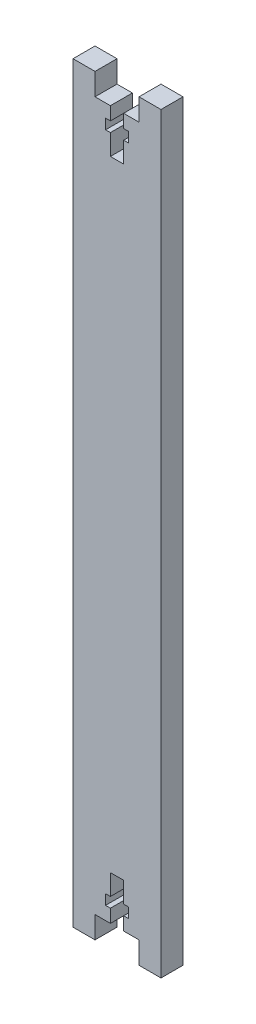
ISO-10303-21;
HEADER;
FILE_DESCRIPTION(('STEP AP214'),'2;1');
FILE_NAME('part.step','',(''),(''),'','','');
FILE_SCHEMA(('AUTOMOTIVE_DESIGN { 1 0 10303 214 1 1 1 1 }'));
ENDSEC;
DATA;
#1=APPLICATION_CONTEXT('core data for automotive mechanical design processes');
#2=APPLICATION_PROTOCOL_DEFINITION('international standard','automotive_design',2000,#1);
#3=PRODUCT_CONTEXT('',#1,'mechanical');
#4=PRODUCT('Part','Part','',(#3));
#5=PRODUCT_RELATED_PRODUCT_CATEGORY('part','',(#4));
#6=PRODUCT_DEFINITION_FORMATION('','',#4);
#7=PRODUCT_DEFINITION_CONTEXT('part definition',#1,'design');
#8=PRODUCT_DEFINITION('design','',#6,#7);
#9=PRODUCT_DEFINITION_SHAPE('','',#8);
#10=(LENGTH_UNIT() NAMED_UNIT(*) SI_UNIT(.MILLI.,.METRE.));
#11=(NAMED_UNIT(*) PLANE_ANGLE_UNIT() SI_UNIT($,.RADIAN.));
#12=(NAMED_UNIT(*) SI_UNIT($,.STERADIAN.) SOLID_ANGLE_UNIT());
#13=UNCERTAINTY_MEASURE_WITH_UNIT(LENGTH_MEASURE(1.E-05),#10,'distance_accuracy_value','');
#14=(GEOMETRIC_REPRESENTATION_CONTEXT(3) GLOBAL_UNCERTAINTY_ASSIGNED_CONTEXT((#13)) GLOBAL_UNIT_ASSIGNED_CONTEXT((#10,
#11,#12)) REPRESENTATION_CONTEXT('',''));
#15=CARTESIAN_POINT('',(0.,0.,0.));
#16=DIRECTION('',(0.,0.,1.));
#17=DIRECTION('',(1.,0.,0.));
#18=AXIS2_PLACEMENT_3D('',#15,#16,#17);
#19=CARTESIAN_POINT('',(-20.,0.,5.));
#20=DIRECTION('',(1.,0.,0.));
#21=DIRECTION('',(0.,0.,-1.));
#22=AXIS2_PLACEMENT_3D('',#19,#20,#21);
#23=PLANE('',#22);
#24=DIRECTION('',(0.,-1.,0.));
#25=VECTOR('',#24,1.);
#26=CARTESIAN_POINT('',(-20.,0.,0.));
#27=LINE('',#26,#25);
#28=CARTESIAN_POINT('',(-20.,171.,0.));
#29=VERTEX_POINT('',#28);
#30=CARTESIAN_POINT('',(-20.,0.,0.));
#31=VERTEX_POINT('',#30);
#32=EDGE_CURVE('E169',#29,#31,#27,.T.);
#33=ORIENTED_EDGE('',*,*,#32,.T.);
#34=DIRECTION('',(0.,0.,-1.));
#35=VECTOR('',#34,1.);
#36=CARTESIAN_POINT('',(-20.,0.,5.));
#37=LINE('',#36,#35);
#38=CARTESIAN_POINT('',(-20.,0.,5.));
#39=VERTEX_POINT('',#38);
#40=EDGE_CURVE('E11',#39,#31,#37,.T.);
#41=ORIENTED_EDGE('',*,*,#40,.F.);
#42=DIRECTION('',(0.,-1.,0.));
#43=VECTOR('',#42,1.);
#44=CARTESIAN_POINT('',(-20.,171.,5.));
#45=LINE('',#44,#43);
#46=CARTESIAN_POINT('',(-20.,171.,5.));
#47=VERTEX_POINT('',#46);
#48=EDGE_CURVE('E175',#47,#39,#45,.T.);
#49=ORIENTED_EDGE('',*,*,#48,.F.);
#50=DIRECTION('',(0.,0.,-1.));
#51=VECTOR('',#50,1.);
#52=CARTESIAN_POINT('',(-20.,171.,5.));
#53=LINE('',#52,#51);
#54=EDGE_CURVE('E293',#47,#29,#53,.T.);
#55=ORIENTED_EDGE('',*,*,#54,.T.);
#56=EDGE_LOOP('',(#33,#41,#49,#55));
#57=FACE_BOUND('',#56,.T.);
#58=ADVANCED_FACE('F33',(#57),#23,.F.);
#59=CARTESIAN_POINT('',(-15.,0.,5.));
#60=DIRECTION('',(0.,1.,0.));
#61=DIRECTION('',(0.,0.,1.));
#62=AXIS2_PLACEMENT_3D('',#59,#60,#61);
#63=PLANE('',#62);
#64=DIRECTION('',(1.,0.,0.));
#65=VECTOR('',#64,1.);
#66=CARTESIAN_POINT('',(-15.,0.,0.));
#67=LINE('',#66,#65);
#68=CARTESIAN_POINT('',(-15.,0.,0.));
#69=VERTEX_POINT('',#68);
#70=EDGE_CURVE('E298',#31,#69,#67,.T.);
#71=ORIENTED_EDGE('',*,*,#70,.T.);
#72=DIRECTION('',(0.,0.,-1.));
#73=VECTOR('',#72,1.);
#74=CARTESIAN_POINT('',(-15.,0.,5.));
#75=LINE('',#74,#73);
#76=CARTESIAN_POINT('',(-15.,0.,5.));
#77=VERTEX_POINT('',#76);
#78=EDGE_CURVE('E41',#77,#69,#75,.T.);
#79=ORIENTED_EDGE('',*,*,#78,.F.);
#80=DIRECTION('',(1.,0.,0.));
#81=VECTOR('',#80,1.);
#82=CARTESIAN_POINT('',(-15.,0.,5.));
#83=LINE('',#82,#81);
#84=EDGE_CURVE('E555',#39,#77,#83,.T.);
#85=ORIENTED_EDGE('',*,*,#84,.F.);
#86=ORIENTED_EDGE('',*,*,#40,.T.);
#87=EDGE_LOOP('',(#71,#79,#85,#86));
#88=FACE_BOUND('',#87,.T.);
#89=ADVANCED_FACE('F558',(#88),#63,.F.);
#90=CARTESIAN_POINT('',(-15.,0.,5.));
#91=DIRECTION('',(-1.,0.,0.));
#92=DIRECTION('',(0.,0.,1.));
#93=AXIS2_PLACEMENT_3D('',#90,#91,#92);
#94=PLANE('',#93);
#95=DIRECTION('',(0.,1.,0.));
#96=VECTOR('',#95,1.);
#97=CARTESIAN_POINT('',(-15.,0.,0.));
#98=LINE('',#97,#96);
#99=CARTESIAN_POINT('',(-15.,5.,0.));
#100=VERTEX_POINT('',#99);
#101=EDGE_CURVE('E300',#69,#100,#98,.T.);
#102=ORIENTED_EDGE('',*,*,#101,.T.);
#103=DIRECTION('',(0.,0.,-1.));
#104=VECTOR('',#103,1.);
#105=CARTESIAN_POINT('',(-15.,5.,5.));
#106=LINE('',#105,#104);
#107=CARTESIAN_POINT('',(-15.,5.,5.));
#108=VERTEX_POINT('',#107);
#109=EDGE_CURVE('E458',#108,#100,#106,.T.);
#110=ORIENTED_EDGE('',*,*,#109,.F.);
#111=DIRECTION('',(0.,1.,0.));
#112=VECTOR('',#111,1.);
#113=CARTESIAN_POINT('',(-15.,0.,5.));
#114=LINE('',#113,#112);
#115=EDGE_CURVE('E467',#77,#108,#114,.T.);
#116=ORIENTED_EDGE('',*,*,#115,.F.);
#117=ORIENTED_EDGE('',*,*,#78,.T.);
#118=EDGE_LOOP('',(#102,#110,#116,#117));
#119=FACE_BOUND('',#118,.T.);
#120=ADVANCED_FACE('F465',(#119),#94,.F.);
#121=CARTESIAN_POINT('',(-11.5,5.,5.));
#122=DIRECTION('',(0.,1.,0.));
#123=DIRECTION('',(-1.,0.,0.));
#124=AXIS2_PLACEMENT_3D('',#121,#122,#123);
#125=PLANE('',#124);
#126=DIRECTION('',(1.,0.,0.));
#127=VECTOR('',#126,1.);
#128=CARTESIAN_POINT('',(-11.5,5.,0.));
#129=LINE('',#128,#127);
#130=CARTESIAN_POINT('',(-11.5,5.,0.));
#131=VERTEX_POINT('',#130);
#132=EDGE_CURVE('E302',#100,#131,#129,.T.);
#133=ORIENTED_EDGE('',*,*,#132,.T.);
#134=DIRECTION('',(0.,0.,-1.));
#135=VECTOR('',#134,1.);
#136=CARTESIAN_POINT('',(-11.5,5.,5.));
#137=LINE('',#136,#135);
#138=CARTESIAN_POINT('',(-11.5,5.,5.));
#139=VERTEX_POINT('',#138);
#140=EDGE_CURVE('E455',#139,#131,#137,.T.);
#141=ORIENTED_EDGE('',*,*,#140,.F.);
#142=DIRECTION('',(1.,0.,0.));
#143=VECTOR('',#142,1.);
#144=CARTESIAN_POINT('',(-11.5,5.,5.));
#145=LINE('',#144,#143);
#146=EDGE_CURVE('E485',#108,#139,#145,.T.);
#147=ORIENTED_EDGE('',*,*,#146,.F.);
#148=ORIENTED_EDGE('',*,*,#109,.T.);
#149=EDGE_LOOP('',(#133,#141,#147,#148));
#150=FACE_BOUND('',#149,.T.);
#151=ADVANCED_FACE('F476',(#150),#125,.F.);
#152=CARTESIAN_POINT('',(-11.5,8.,5.));
#153=DIRECTION('',(-1.,0.,0.));
#154=DIRECTION('',(0.,-1.,0.));
#155=AXIS2_PLACEMENT_3D('',#152,#153,#154);
#156=PLANE('',#155);
#157=DIRECTION('',(0.,1.,0.));
#158=VECTOR('',#157,1.);
#159=CARTESIAN_POINT('',(-11.5,8.,0.));
#160=LINE('',#159,#158);
#161=CARTESIAN_POINT('',(-11.5,8.,0.));
#162=VERTEX_POINT('',#161);
#163=EDGE_CURVE('E304',#131,#162,#160,.T.);
#164=ORIENTED_EDGE('',*,*,#163,.T.);
#165=DIRECTION('',(0.,0.,-1.));
#166=VECTOR('',#165,1.);
#167=CARTESIAN_POINT('',(-11.5,8.,5.));
#168=LINE('',#167,#166);
#169=CARTESIAN_POINT('',(-11.5,8.,5.));
#170=VERTEX_POINT('',#169);
#171=EDGE_CURVE('E452',#170,#162,#168,.T.);
#172=ORIENTED_EDGE('',*,*,#171,.F.);
#173=DIRECTION('',(0.,1.,0.));
#174=VECTOR('',#173,1.);
#175=CARTESIAN_POINT('',(-11.5,8.,5.));
#176=LINE('',#175,#174);
#177=EDGE_CURVE('E482',#139,#170,#176,.T.);
#178=ORIENTED_EDGE('',*,*,#177,.F.);
#179=ORIENTED_EDGE('',*,*,#140,.T.);
#180=EDGE_LOOP('',(#164,#172,#178,#179));
#181=FACE_BOUND('',#180,.T.);
#182=ADVANCED_FACE('F480',(#181),#156,.F.);
#183=CARTESIAN_POINT('',(-11.5,8.,5.));
#184=DIRECTION('',(0.,-1.,0.));
#185=DIRECTION('',(1.,0.,0.));
#186=AXIS2_PLACEMENT_3D('',#183,#184,#185);
#187=PLANE('',#186);
#188=DIRECTION('',(-1.,0.,0.));
#189=VECTOR('',#188,1.);
#190=CARTESIAN_POINT('',(-11.5,8.,0.));
#191=LINE('',#190,#189);
#192=CARTESIAN_POINT('',(-12.6,8.00000000000001,0.));
#193=VERTEX_POINT('',#192);
#194=EDGE_CURVE('E306',#162,#193,#191,.T.);
#195=ORIENTED_EDGE('',*,*,#194,.T.);
#196=DIRECTION('',(0.,0.,-1.));
#197=VECTOR('',#196,1.);
#198=CARTESIAN_POINT('',(-12.6,8.00000000000001,5.));
#199=LINE('',#198,#197);
#200=CARTESIAN_POINT('',(-12.6,8.00000000000001,5.));
#201=VERTEX_POINT('',#200);
#202=EDGE_CURVE('E449',#201,#193,#199,.T.);
#203=ORIENTED_EDGE('',*,*,#202,.F.);
#204=DIRECTION('',(-1.,0.,0.));
#205=VECTOR('',#204,1.);
#206=CARTESIAN_POINT('',(-11.5,8.,5.));
#207=LINE('',#206,#205);
#208=EDGE_CURVE('E484',#170,#201,#207,.T.);
#209=ORIENTED_EDGE('',*,*,#208,.F.);
#210=ORIENTED_EDGE('',*,*,#171,.T.);
#211=EDGE_LOOP('',(#195,#203,#209,#210));
#212=FACE_BOUND('',#211,.T.);
#213=ADVANCED_FACE('F570',(#212),#187,.F.);
#214=CARTESIAN_POINT('',(-12.6,8.00000000000001,5.));
#215=DIRECTION('',(-1.,0.,0.));
#216=DIRECTION('',(0.,-1.,0.));
#217=AXIS2_PLACEMENT_3D('',#214,#215,#216);
#218=PLANE('',#217);
#219=DIRECTION('',(0.,1.,0.));
#220=VECTOR('',#219,1.);
#221=CARTESIAN_POINT('',(-12.6,8.00000000000001,0.));
#222=LINE('',#221,#220);
#223=CARTESIAN_POINT('',(-12.6,10.3,0.));
#224=VERTEX_POINT('',#223);
#225=EDGE_CURVE('E308',#193,#224,#222,.T.);
#226=ORIENTED_EDGE('',*,*,#225,.T.);
#227=DIRECTION('',(0.,0.,-1.));
#228=VECTOR('',#227,1.);
#229=CARTESIAN_POINT('',(-12.6,10.3,5.));
#230=LINE('',#229,#228);
#231=CARTESIAN_POINT('',(-12.6,10.3,5.));
#232=VERTEX_POINT('',#231);
#233=EDGE_CURVE('E446',#232,#224,#230,.T.);
#234=ORIENTED_EDGE('',*,*,#233,.F.);
#235=DIRECTION('',(0.,1.,0.));
#236=VECTOR('',#235,1.);
#237=CARTESIAN_POINT('',(-12.6,8.00000000000001,5.));
#238=LINE('',#237,#236);
#239=EDGE_CURVE('E487',#201,#232,#238,.T.);
#240=ORIENTED_EDGE('',*,*,#239,.F.);
#241=ORIENTED_EDGE('',*,*,#202,.T.);
#242=EDGE_LOOP('',(#226,#234,#240,#241));
#243=FACE_BOUND('',#242,.T.);
#244=ADVANCED_FACE('F573',(#243),#218,.F.);
#245=CARTESIAN_POINT('',(-12.6,10.3,5.));
#246=DIRECTION('',(0.,1.,0.));
#247=DIRECTION('',(-1.,0.,0.));
#248=AXIS2_PLACEMENT_3D('',#245,#246,#247);
#249=PLANE('',#248);
#250=DIRECTION('',(1.,0.,0.));
#251=VECTOR('',#250,1.);
#252=CARTESIAN_POINT('',(-12.6,10.3,0.));
#253=LINE('',#252,#251);
#254=CARTESIAN_POINT('',(-11.5,10.3,0.));
#255=VERTEX_POINT('',#254);
#256=EDGE_CURVE('E310',#224,#255,#253,.T.);
#257=ORIENTED_EDGE('',*,*,#256,.T.);
#258=DIRECTION('',(0.,0.,-1.));
#259=VECTOR('',#258,1.);
#260=CARTESIAN_POINT('',(-11.5,10.3,5.));
#261=LINE('',#260,#259);
#262=CARTESIAN_POINT('',(-11.5,10.3,5.));
#263=VERTEX_POINT('',#262);
#264=EDGE_CURVE('E443',#263,#255,#261,.T.);
#265=ORIENTED_EDGE('',*,*,#264,.F.);
#266=DIRECTION('',(1.,0.,0.));
#267=VECTOR('',#266,1.);
#268=CARTESIAN_POINT('',(-12.6,10.3,5.));
#269=LINE('',#268,#267);
#270=EDGE_CURVE('E493',#232,#263,#269,.T.);
#271=ORIENTED_EDGE('',*,*,#270,.F.);
#272=ORIENTED_EDGE('',*,*,#233,.T.);
#273=EDGE_LOOP('',(#257,#265,#271,#272));
#274=FACE_BOUND('',#273,.T.);
#275=ADVANCED_FACE('F577',(#274),#249,.F.);
#276=CARTESIAN_POINT('',(-11.5,15.,5.));
#277=DIRECTION('',(-1.,0.,0.));
#278=DIRECTION('',(0.,-1.,0.));
#279=AXIS2_PLACEMENT_3D('',#276,#277,#278);
#280=PLANE('',#279);
#281=DIRECTION('',(0.,1.,0.));
#282=VECTOR('',#281,1.);
#283=CARTESIAN_POINT('',(-11.5,15.,0.));
#284=LINE('',#283,#282);
#285=CARTESIAN_POINT('',(-11.5,15.,0.));
#286=VERTEX_POINT('',#285);
#287=EDGE_CURVE('E312',#255,#286,#284,.T.);
#288=ORIENTED_EDGE('',*,*,#287,.T.);
#289=DIRECTION('',(0.,0.,-1.));
#290=VECTOR('',#289,1.);
#291=CARTESIAN_POINT('',(-11.5,15.,5.));
#292=LINE('',#291,#290);
#293=CARTESIAN_POINT('',(-11.5,15.,5.));
#294=VERTEX_POINT('',#293);
#295=EDGE_CURVE('E440',#294,#286,#292,.T.);
#296=ORIENTED_EDGE('',*,*,#295,.F.);
#297=DIRECTION('',(0.,1.,0.));
#298=VECTOR('',#297,1.);
#299=CARTESIAN_POINT('',(-11.5,15.,5.));
#300=LINE('',#299,#298);
#301=EDGE_CURVE('E495',#263,#294,#300,.T.);
#302=ORIENTED_EDGE('',*,*,#301,.F.);
#303=ORIENTED_EDGE('',*,*,#264,.T.);
#304=EDGE_LOOP('',(#288,#296,#302,#303));
#305=FACE_BOUND('',#304,.T.);
#306=ADVANCED_FACE('F581',(#305),#280,.F.);
#307=CARTESIAN_POINT('',(-8.5,15.,5.));
#308=DIRECTION('',(0.,1.,0.));
#309=DIRECTION('',(0.,0.,1.));
#310=AXIS2_PLACEMENT_3D('',#307,#308,#309);
#311=PLANE('',#310);
#312=DIRECTION('',(1.,0.,0.));
#313=VECTOR('',#312,1.);
#314=CARTESIAN_POINT('',(-8.5,15.,0.));
#315=LINE('',#314,#313);
#316=CARTESIAN_POINT('',(-8.5,15.,0.));
#317=VERTEX_POINT('',#316);
#318=EDGE_CURVE('E314',#286,#317,#315,.T.);
#319=ORIENTED_EDGE('',*,*,#318,.T.);
#320=DIRECTION('',(0.,0.,-1.));
#321=VECTOR('',#320,1.);
#322=CARTESIAN_POINT('',(-8.5,15.,5.));
#323=LINE('',#322,#321);
#324=CARTESIAN_POINT('',(-8.5,15.,5.));
#325=VERTEX_POINT('',#324);
#326=EDGE_CURVE('E437',#325,#317,#323,.T.);
#327=ORIENTED_EDGE('',*,*,#326,.F.);
#328=DIRECTION('',(1.,0.,0.));
#329=VECTOR('',#328,1.);
#330=CARTESIAN_POINT('',(-8.5,15.,5.));
#331=LINE('',#330,#329);
#332=EDGE_CURVE('E497',#294,#325,#331,.T.);
#333=ORIENTED_EDGE('',*,*,#332,.F.);
#334=ORIENTED_EDGE('',*,*,#295,.T.);
#335=EDGE_LOOP('',(#319,#327,#333,#334));
#336=FACE_BOUND('',#335,.T.);
#337=ADVANCED_FACE('F585',(#336),#311,.F.);
#338=CARTESIAN_POINT('',(-8.5,10.3,5.));
#339=DIRECTION('',(1.,0.,0.));
#340=DIRECTION('',(0.,0.,-1.));
#341=AXIS2_PLACEMENT_3D('',#338,#339,#340);
#342=PLANE('',#341);
#343=DIRECTION('',(0.,-1.,0.));
#344=VECTOR('',#343,1.);
#345=CARTESIAN_POINT('',(-8.5,10.3,0.));
#346=LINE('',#345,#344);
#347=CARTESIAN_POINT('',(-8.5,10.3,0.));
#348=VERTEX_POINT('',#347);
#349=EDGE_CURVE('E316',#317,#348,#346,.T.);
#350=ORIENTED_EDGE('',*,*,#349,.T.);
#351=DIRECTION('',(0.,0.,-1.));
#352=VECTOR('',#351,1.);
#353=CARTESIAN_POINT('',(-8.5,10.3,5.));
#354=LINE('',#353,#352);
#355=CARTESIAN_POINT('',(-8.5,10.3,5.));
#356=VERTEX_POINT('',#355);
#357=EDGE_CURVE('E434',#356,#348,#354,.T.);
#358=ORIENTED_EDGE('',*,*,#357,.F.);
#359=DIRECTION('',(0.,-1.,0.));
#360=VECTOR('',#359,1.);
#361=CARTESIAN_POINT('',(-8.5,10.3,5.));
#362=LINE('',#361,#360);
#363=EDGE_CURVE('E499',#325,#356,#362,.T.);
#364=ORIENTED_EDGE('',*,*,#363,.F.);
#365=ORIENTED_EDGE('',*,*,#326,.T.);
#366=EDGE_LOOP('',(#350,#358,#364,#365));
#367=FACE_BOUND('',#366,.T.);
#368=ADVANCED_FACE('F589',(#367),#342,.F.);
#369=CARTESIAN_POINT('',(-8.5,10.3,5.));
#370=DIRECTION('',(0.,1.,0.));
#371=DIRECTION('',(-1.,0.,0.));
#372=AXIS2_PLACEMENT_3D('',#369,#370,#371);
#373=PLANE('',#372);
#374=DIRECTION('',(1.,0.,0.));
#375=VECTOR('',#374,1.);
#376=CARTESIAN_POINT('',(-8.5,10.3,0.));
#377=LINE('',#376,#375);
#378=CARTESIAN_POINT('',(-7.4,10.3,0.));
#379=VERTEX_POINT('',#378);
#380=EDGE_CURVE('E318',#348,#379,#377,.T.);
#381=ORIENTED_EDGE('',*,*,#380,.T.);
#382=DIRECTION('',(0.,0.,-1.));
#383=VECTOR('',#382,1.);
#384=CARTESIAN_POINT('',(-7.4,10.3,5.));
#385=LINE('',#384,#383);
#386=CARTESIAN_POINT('',(-7.4,10.3,5.));
#387=VERTEX_POINT('',#386);
#388=EDGE_CURVE('E431',#387,#379,#385,.T.);
#389=ORIENTED_EDGE('',*,*,#388,.F.);
#390=DIRECTION('',(1.,0.,0.));
#391=VECTOR('',#390,1.);
#392=CARTESIAN_POINT('',(-8.5,10.3,5.));
#393=LINE('',#392,#391);
#394=EDGE_CURVE('E501',#356,#387,#393,.T.);
#395=ORIENTED_EDGE('',*,*,#394,.F.);
#396=ORIENTED_EDGE('',*,*,#357,.T.);
#397=EDGE_LOOP('',(#381,#389,#395,#396));
#398=FACE_BOUND('',#397,.T.);
#399=ADVANCED_FACE('F593',(#398),#373,.F.);
#400=CARTESIAN_POINT('',(-7.4,10.3,5.));
#401=DIRECTION('',(1.,0.,0.));
#402=DIRECTION('',(0.,1.,0.));
#403=AXIS2_PLACEMENT_3D('',#400,#401,#402);
#404=PLANE('',#403);
#405=DIRECTION('',(0.,-1.,0.));
#406=VECTOR('',#405,1.);
#407=CARTESIAN_POINT('',(-7.4,10.3,0.));
#408=LINE('',#407,#406);
#409=CARTESIAN_POINT('',(-7.4,8.,0.));
#410=VERTEX_POINT('',#409);
#411=EDGE_CURVE('E320',#379,#410,#408,.T.);
#412=ORIENTED_EDGE('',*,*,#411,.T.);
#413=DIRECTION('',(0.,0.,-1.));
#414=VECTOR('',#413,1.);
#415=CARTESIAN_POINT('',(-7.4,8.,5.));
#416=LINE('',#415,#414);
#417=CARTESIAN_POINT('',(-7.4,8.,5.));
#418=VERTEX_POINT('',#417);
#419=EDGE_CURVE('E428',#418,#410,#416,.T.);
#420=ORIENTED_EDGE('',*,*,#419,.F.);
#421=DIRECTION('',(0.,-1.,0.));
#422=VECTOR('',#421,1.);
#423=CARTESIAN_POINT('',(-7.4,10.3,5.));
#424=LINE('',#423,#422);
#425=EDGE_CURVE('E503',#387,#418,#424,.T.);
#426=ORIENTED_EDGE('',*,*,#425,.F.);
#427=ORIENTED_EDGE('',*,*,#388,.T.);
#428=EDGE_LOOP('',(#412,#420,#426,#427));
#429=FACE_BOUND('',#428,.T.);
#430=ADVANCED_FACE('F597',(#429),#404,.F.);
#431=CARTESIAN_POINT('',(-7.4,8.,5.));
#432=DIRECTION('',(0.,-1.,0.));
#433=DIRECTION('',(0.,0.,-1.));
#434=AXIS2_PLACEMENT_3D('',#431,#432,#433);
#435=PLANE('',#434);
#436=DIRECTION('',(-1.,0.,0.));
#437=VECTOR('',#436,1.);
#438=CARTESIAN_POINT('',(-7.4,8.,0.));
#439=LINE('',#438,#437);
#440=CARTESIAN_POINT('',(-8.5,8.,0.));
#441=VERTEX_POINT('',#440);
#442=EDGE_CURVE('E322',#410,#441,#439,.T.);
#443=ORIENTED_EDGE('',*,*,#442,.T.);
#444=DIRECTION('',(0.,0.,-1.));
#445=VECTOR('',#444,1.);
#446=CARTESIAN_POINT('',(-8.5,8.,5.));
#447=LINE('',#446,#445);
#448=CARTESIAN_POINT('',(-8.5,8.,5.));
#449=VERTEX_POINT('',#448);
#450=EDGE_CURVE('E425',#449,#441,#447,.T.);
#451=ORIENTED_EDGE('',*,*,#450,.F.);
#452=DIRECTION('',(-1.,0.,0.));
#453=VECTOR('',#452,1.);
#454=CARTESIAN_POINT('',(-7.4,8.,5.));
#455=LINE('',#454,#453);
#456=EDGE_CURVE('E505',#418,#449,#455,.T.);
#457=ORIENTED_EDGE('',*,*,#456,.F.);
#458=ORIENTED_EDGE('',*,*,#419,.T.);
#459=EDGE_LOOP('',(#443,#451,#457,#458));
#460=FACE_BOUND('',#459,.T.);
#461=ADVANCED_FACE('F601',(#460),#435,.F.);
#462=CARTESIAN_POINT('',(-8.5,5.,5.));
#463=DIRECTION('',(1.,0.,0.));
#464=DIRECTION('',(0.,1.,0.));
#465=AXIS2_PLACEMENT_3D('',#462,#463,#464);
#466=PLANE('',#465);
#467=DIRECTION('',(0.,-1.,0.));
#468=VECTOR('',#467,1.);
#469=CARTESIAN_POINT('',(-8.5,5.,0.));
#470=LINE('',#469,#468);
#471=CARTESIAN_POINT('',(-8.5,5.,0.));
#472=VERTEX_POINT('',#471);
#473=EDGE_CURVE('E324',#441,#472,#470,.T.);
#474=ORIENTED_EDGE('',*,*,#473,.T.);
#475=DIRECTION('',(0.,0.,-1.));
#476=VECTOR('',#475,1.);
#477=CARTESIAN_POINT('',(-8.5,5.,5.));
#478=LINE('',#477,#476);
#479=CARTESIAN_POINT('',(-8.5,5.,5.));
#480=VERTEX_POINT('',#479);
#481=EDGE_CURVE('E422',#480,#472,#478,.T.);
#482=ORIENTED_EDGE('',*,*,#481,.F.);
#483=DIRECTION('',(0.,-1.,0.));
#484=VECTOR('',#483,1.);
#485=CARTESIAN_POINT('',(-8.5,5.,5.));
#486=LINE('',#485,#484);
#487=EDGE_CURVE('E507',#449,#480,#486,.T.);
#488=ORIENTED_EDGE('',*,*,#487,.F.);
#489=ORIENTED_EDGE('',*,*,#450,.T.);
#490=EDGE_LOOP('',(#474,#482,#488,#489));
#491=FACE_BOUND('',#490,.T.);
#492=ADVANCED_FACE('F605',(#491),#466,.F.);
#493=CARTESIAN_POINT('',(-8.5,5.,5.));
#494=DIRECTION('',(0.,1.,0.));
#495=DIRECTION('',(0.,0.,1.));
#496=AXIS2_PLACEMENT_3D('',#493,#494,#495);
#497=PLANE('',#496);
#498=DIRECTION('',(1.,0.,0.));
#499=VECTOR('',#498,1.);
#500=CARTESIAN_POINT('',(-8.5,5.,0.));
#501=LINE('',#500,#499);
#502=CARTESIAN_POINT('',(-5.,5.,0.));
#503=VERTEX_POINT('',#502);
#504=EDGE_CURVE('E326',#472,#503,#501,.T.);
#505=ORIENTED_EDGE('',*,*,#504,.T.);
#506=DIRECTION('',(0.,0.,-1.));
#507=VECTOR('',#506,1.);
#508=CARTESIAN_POINT('',(-5.,5.,5.));
#509=LINE('',#508,#507);
#510=CARTESIAN_POINT('',(-5.,5.,5.));
#511=VERTEX_POINT('',#510);
#512=EDGE_CURVE('E419',#511,#503,#509,.T.);
#513=ORIENTED_EDGE('',*,*,#512,.F.);
#514=DIRECTION('',(1.,0.,0.));
#515=VECTOR('',#514,1.);
#516=CARTESIAN_POINT('',(-8.5,5.,5.));
#517=LINE('',#516,#515);
#518=EDGE_CURVE('E509',#480,#511,#517,.T.);
#519=ORIENTED_EDGE('',*,*,#518,.F.);
#520=ORIENTED_EDGE('',*,*,#481,.T.);
#521=EDGE_LOOP('',(#505,#513,#519,#520));
#522=FACE_BOUND('',#521,.T.);
#523=ADVANCED_FACE('F609',(#522),#497,.F.);
#524=CARTESIAN_POINT('',(-5.,5.,5.));
#525=DIRECTION('',(1.,0.,0.));
#526=DIRECTION('',(0.,1.,0.));
#527=AXIS2_PLACEMENT_3D('',#524,#525,#526);
#528=PLANE('',#527);
#529=DIRECTION('',(0.,-1.,0.));
#530=VECTOR('',#529,1.);
#531=CARTESIAN_POINT('',(-5.,5.,0.));
#532=LINE('',#531,#530);
#533=CARTESIAN_POINT('',(-5.,0.,0.));
#534=VERTEX_POINT('',#533);
#535=EDGE_CURVE('E328',#503,#534,#532,.T.);
#536=ORIENTED_EDGE('',*,*,#535,.T.);
#537=DIRECTION('',(0.,0.,-1.));
#538=VECTOR('',#537,1.);
#539=CARTESIAN_POINT('',(-5.,0.,5.));
#540=LINE('',#539,#538);
#541=CARTESIAN_POINT('',(-5.,0.,5.));
#542=VERTEX_POINT('',#541);
#543=EDGE_CURVE('E416',#542,#534,#540,.T.);
#544=ORIENTED_EDGE('',*,*,#543,.F.);
#545=DIRECTION('',(0.,-1.,0.));
#546=VECTOR('',#545,1.);
#547=CARTESIAN_POINT('',(-5.,5.,5.));
#548=LINE('',#547,#546);
#549=EDGE_CURVE('E511',#511,#542,#548,.T.);
#550=ORIENTED_EDGE('',*,*,#549,.F.);
#551=ORIENTED_EDGE('',*,*,#512,.T.);
#552=EDGE_LOOP('',(#536,#544,#550,#551));
#553=FACE_BOUND('',#552,.T.);
#554=ADVANCED_FACE('F613',(#553),#528,.F.);
#555=CARTESIAN_POINT('',(-5.,0.,5.));
#556=DIRECTION('',(0.,1.,0.));
#557=DIRECTION('',(0.,0.,1.));
#558=AXIS2_PLACEMENT_3D('',#555,#556,#557);
#559=PLANE('',#558);
#560=DIRECTION('',(1.,0.,0.));
#561=VECTOR('',#560,1.);
#562=CARTESIAN_POINT('',(-5.,0.,0.));
#563=LINE('',#562,#561);
#564=CARTESIAN_POINT('',(0.,0.,0.));
#565=VERTEX_POINT('',#564);
#566=EDGE_CURVE('E330',#534,#565,#563,.T.);
#567=ORIENTED_EDGE('',*,*,#566,.T.);
#568=DIRECTION('',(0.,0.,-1.));
#569=VECTOR('',#568,1.);
#570=CARTESIAN_POINT('',(0.,0.,5.));
#571=LINE('',#570,#569);
#572=CARTESIAN_POINT('',(0.,0.,5.));
#573=VERTEX_POINT('',#572);
#574=EDGE_CURVE('E413',#573,#565,#571,.T.);
#575=ORIENTED_EDGE('',*,*,#574,.F.);
#576=DIRECTION('',(1.,0.,0.));
#577=VECTOR('',#576,1.);
#578=CARTESIAN_POINT('',(-5.,0.,5.));
#579=LINE('',#578,#577);
#580=EDGE_CURVE('E513',#542,#573,#579,.T.);
#581=ORIENTED_EDGE('',*,*,#580,.F.);
#582=ORIENTED_EDGE('',*,*,#543,.T.);
#583=EDGE_LOOP('',(#567,#575,#581,#582));
#584=FACE_BOUND('',#583,.T.);
#585=ADVANCED_FACE('F617',(#584),#559,.F.);
#586=CARTESIAN_POINT('',(0.,171.,5.));
#587=DIRECTION('',(-1.,0.,0.));
#588=DIRECTION('',(0.,-1.,0.));
#589=AXIS2_PLACEMENT_3D('',#586,#587,#588);
#590=PLANE('',#589);
#591=DIRECTION('',(0.,1.,0.));
#592=VECTOR('',#591,1.);
#593=CARTESIAN_POINT('',(0.,171.,0.));
#594=LINE('',#593,#592);
#595=CARTESIAN_POINT('',(0.,171.,0.));
#596=VERTEX_POINT('',#595);
#597=EDGE_CURVE('E333',#565,#596,#594,.T.);
#598=ORIENTED_EDGE('',*,*,#597,.T.);
#599=DIRECTION('',(0.,0.,-1.));
#600=VECTOR('',#599,1.);
#601=CARTESIAN_POINT('',(0.,171.,5.));
#602=LINE('',#601,#600);
#603=CARTESIAN_POINT('',(0.,171.,5.));
#604=VERTEX_POINT('',#603);
#605=EDGE_CURVE('E410',#604,#596,#602,.T.);
#606=ORIENTED_EDGE('',*,*,#605,.F.);
#607=DIRECTION('',(0.,1.,0.));
#608=VECTOR('',#607,1.);
#609=CARTESIAN_POINT('',(0.,0.,5.));
#610=LINE('',#609,#608);
#611=EDGE_CURVE('E515',#573,#604,#610,.T.);
#612=ORIENTED_EDGE('',*,*,#611,.F.);
#613=ORIENTED_EDGE('',*,*,#574,.T.);
#614=EDGE_LOOP('',(#598,#606,#612,#613));
#615=FACE_BOUND('',#614,.T.);
#616=ADVANCED_FACE('F621',(#615),#590,.F.);
#617=CARTESIAN_POINT('',(-4.99999999999997,171.,5.));
#618=DIRECTION('',(0.,-1.,0.));
#619=DIRECTION('',(0.,0.,-1.));
#620=AXIS2_PLACEMENT_3D('',#617,#618,#619);
#621=PLANE('',#620);
#622=DIRECTION('',(-1.,0.,0.));
#623=VECTOR('',#622,1.);
#624=CARTESIAN_POINT('',(-4.99999999999997,171.,0.));
#625=LINE('',#624,#623);
#626=CARTESIAN_POINT('',(-4.99999999999997,171.,0.));
#627=VERTEX_POINT('',#626);
#628=EDGE_CURVE('E335',#596,#627,#625,.T.);
#629=ORIENTED_EDGE('',*,*,#628,.T.);
#630=DIRECTION('',(0.,0.,-1.));
#631=VECTOR('',#630,1.);
#632=CARTESIAN_POINT('',(-4.99999999999997,171.,5.));
#633=LINE('',#632,#631);
#634=CARTESIAN_POINT('',(-4.99999999999997,171.,5.));
#635=VERTEX_POINT('',#634);
#636=EDGE_CURVE('E407',#635,#627,#633,.T.);
#637=ORIENTED_EDGE('',*,*,#636,.F.);
#638=DIRECTION('',(-1.,0.,0.));
#639=VECTOR('',#638,1.);
#640=CARTESIAN_POINT('',(-4.99999999999997,171.,5.));
#641=LINE('',#640,#639);
#642=EDGE_CURVE('E517',#604,#635,#641,.T.);
#643=ORIENTED_EDGE('',*,*,#642,.F.);
#644=ORIENTED_EDGE('',*,*,#605,.T.);
#645=EDGE_LOOP('',(#629,#637,#643,#644));
#646=FACE_BOUND('',#645,.T.);
#647=ADVANCED_FACE('F625',(#646),#621,.F.);
#648=CARTESIAN_POINT('',(-4.99999999999997,171.,5.));
#649=DIRECTION('',(1.,0.,0.));
#650=DIRECTION('',(0.,1.,0.));
#651=AXIS2_PLACEMENT_3D('',#648,#649,#650);
#652=PLANE('',#651);
#653=DIRECTION('',(0.,-1.,0.));
#654=VECTOR('',#653,1.);
#655=CARTESIAN_POINT('',(-4.99999999999997,171.,0.));
#656=LINE('',#655,#654);
#657=CARTESIAN_POINT('',(-4.99999999999997,166.,0.));
#658=VERTEX_POINT('',#657);
#659=EDGE_CURVE('E337',#627,#658,#656,.T.);
#660=ORIENTED_EDGE('',*,*,#659,.T.);
#661=DIRECTION('',(0.,0.,-1.));
#662=VECTOR('',#661,1.);
#663=CARTESIAN_POINT('',(-4.99999999999997,166.,5.));
#664=LINE('',#663,#662);
#665=CARTESIAN_POINT('',(-4.99999999999997,166.,5.));
#666=VERTEX_POINT('',#665);
#667=EDGE_CURVE('E404',#666,#658,#664,.T.);
#668=ORIENTED_EDGE('',*,*,#667,.F.);
#669=DIRECTION('',(0.,-1.,0.));
#670=VECTOR('',#669,1.);
#671=CARTESIAN_POINT('',(-4.99999999999997,171.,5.));
#672=LINE('',#671,#670);
#673=EDGE_CURVE('E519',#635,#666,#672,.T.);
#674=ORIENTED_EDGE('',*,*,#673,.F.);
#675=ORIENTED_EDGE('',*,*,#636,.T.);
#676=EDGE_LOOP('',(#660,#668,#674,#675));
#677=FACE_BOUND('',#676,.T.);
#678=ADVANCED_FACE('F629',(#677),#652,.F.);
#679=CARTESIAN_POINT('',(-8.49999999999997,166.,5.));
#680=DIRECTION('',(0.,-1.,0.));
#681=DIRECTION('',(0.,0.,-1.));
#682=AXIS2_PLACEMENT_3D('',#679,#680,#681);
#683=PLANE('',#682);
#684=DIRECTION('',(-1.,0.,0.));
#685=VECTOR('',#684,1.);
#686=CARTESIAN_POINT('',(-8.49999999999997,166.,0.));
#687=LINE('',#686,#685);
#688=CARTESIAN_POINT('',(-8.49999999999997,166.,0.));
#689=VERTEX_POINT('',#688);
#690=EDGE_CURVE('E339',#658,#689,#687,.T.);
#691=ORIENTED_EDGE('',*,*,#690,.T.);
#692=DIRECTION('',(0.,0.,-1.));
#693=VECTOR('',#692,1.);
#694=CARTESIAN_POINT('',(-8.49999999999997,166.,5.));
#695=LINE('',#694,#693);
#696=CARTESIAN_POINT('',(-8.49999999999997,166.,5.));
#697=VERTEX_POINT('',#696);
#698=EDGE_CURVE('E401',#697,#689,#695,.T.);
#699=ORIENTED_EDGE('',*,*,#698,.F.);
#700=DIRECTION('',(-1.,0.,0.));
#701=VECTOR('',#700,1.);
#702=CARTESIAN_POINT('',(-8.49999999999997,166.,5.));
#703=LINE('',#702,#701);
#704=EDGE_CURVE('E521',#666,#697,#703,.T.);
#705=ORIENTED_EDGE('',*,*,#704,.F.);
#706=ORIENTED_EDGE('',*,*,#667,.T.);
#707=EDGE_LOOP('',(#691,#699,#705,#706));
#708=FACE_BOUND('',#707,.T.);
#709=ADVANCED_FACE('F633',(#708),#683,.F.);
#710=CARTESIAN_POINT('',(-8.49999999999997,163.,5.));
#711=DIRECTION('',(1.,0.,0.));
#712=DIRECTION('',(0.,1.,0.));
#713=AXIS2_PLACEMENT_3D('',#710,#711,#712);
#714=PLANE('',#713);
#715=DIRECTION('',(0.,-1.,0.));
#716=VECTOR('',#715,1.);
#717=CARTESIAN_POINT('',(-8.49999999999997,163.,0.));
#718=LINE('',#717,#716);
#719=CARTESIAN_POINT('',(-8.49999999999997,163.,0.));
#720=VERTEX_POINT('',#719);
#721=EDGE_CURVE('E341',#689,#720,#718,.T.);
#722=ORIENTED_EDGE('',*,*,#721,.T.);
#723=DIRECTION('',(0.,0.,-1.));
#724=VECTOR('',#723,1.);
#725=CARTESIAN_POINT('',(-8.49999999999997,163.,5.));
#726=LINE('',#725,#724);
#727=CARTESIAN_POINT('',(-8.49999999999997,163.,5.));
#728=VERTEX_POINT('',#727);
#729=EDGE_CURVE('E398',#728,#720,#726,.T.);
#730=ORIENTED_EDGE('',*,*,#729,.F.);
#731=DIRECTION('',(0.,-1.,0.));
#732=VECTOR('',#731,1.);
#733=CARTESIAN_POINT('',(-8.49999999999997,163.,5.));
#734=LINE('',#733,#732);
#735=EDGE_CURVE('E523',#697,#728,#734,.T.);
#736=ORIENTED_EDGE('',*,*,#735,.F.);
#737=ORIENTED_EDGE('',*,*,#698,.T.);
#738=EDGE_LOOP('',(#722,#730,#736,#737));
#739=FACE_BOUND('',#738,.T.);
#740=ADVANCED_FACE('F637',(#739),#714,.F.);
#741=CARTESIAN_POINT('',(-8.49999999999997,163.,5.));
#742=DIRECTION('',(0.,1.,0.));
#743=DIRECTION('',(0.,0.,1.));
#744=AXIS2_PLACEMENT_3D('',#741,#742,#743);
#745=PLANE('',#744);
#746=DIRECTION('',(1.,0.,0.));
#747=VECTOR('',#746,1.);
#748=CARTESIAN_POINT('',(-8.49999999999997,163.,0.));
#749=LINE('',#748,#747);
#750=CARTESIAN_POINT('',(-7.40000000000002,163.,0.));
#751=VERTEX_POINT('',#750);
#752=EDGE_CURVE('E343',#720,#751,#749,.T.);
#753=ORIENTED_EDGE('',*,*,#752,.T.);
#754=DIRECTION('',(0.,0.,-1.));
#755=VECTOR('',#754,1.);
#756=CARTESIAN_POINT('',(-7.40000000000002,163.,5.));
#757=LINE('',#756,#755);
#758=CARTESIAN_POINT('',(-7.40000000000002,163.,5.));
#759=VERTEX_POINT('',#758);
#760=EDGE_CURVE('E395',#759,#751,#757,.T.);
#761=ORIENTED_EDGE('',*,*,#760,.F.);
#762=DIRECTION('',(1.,0.,0.));
#763=VECTOR('',#762,1.);
#764=CARTESIAN_POINT('',(-8.49999999999997,163.,5.));
#765=LINE('',#764,#763);
#766=EDGE_CURVE('E525',#728,#759,#765,.T.);
#767=ORIENTED_EDGE('',*,*,#766,.F.);
#768=ORIENTED_EDGE('',*,*,#729,.T.);
#769=EDGE_LOOP('',(#753,#761,#767,#768));
#770=FACE_BOUND('',#769,.T.);
#771=ADVANCED_FACE('F641',(#770),#745,.F.);
#772=CARTESIAN_POINT('',(-7.40000000000002,163.,5.));
#773=DIRECTION('',(1.,0.,0.));
#774=DIRECTION('',(0.,1.,0.));
#775=AXIS2_PLACEMENT_3D('',#772,#773,#774);
#776=PLANE('',#775);
#777=DIRECTION('',(0.,-1.,0.));
#778=VECTOR('',#777,1.);
#779=CARTESIAN_POINT('',(-7.40000000000002,163.,0.));
#780=LINE('',#779,#778);
#781=CARTESIAN_POINT('',(-7.40000000000002,160.7,0.));
#782=VERTEX_POINT('',#781);
#783=EDGE_CURVE('E345',#751,#782,#780,.T.);
#784=ORIENTED_EDGE('',*,*,#783,.T.);
#785=DIRECTION('',(0.,0.,-1.));
#786=VECTOR('',#785,1.);
#787=CARTESIAN_POINT('',(-7.40000000000002,160.7,5.));
#788=LINE('',#787,#786);
#789=CARTESIAN_POINT('',(-7.40000000000002,160.7,5.));
#790=VERTEX_POINT('',#789);
#791=EDGE_CURVE('E392',#790,#782,#788,.T.);
#792=ORIENTED_EDGE('',*,*,#791,.F.);
#793=DIRECTION('',(0.,-1.,0.));
#794=VECTOR('',#793,1.);
#795=CARTESIAN_POINT('',(-7.40000000000002,163.,5.));
#796=LINE('',#795,#794);
#797=EDGE_CURVE('E527',#759,#790,#796,.T.);
#798=ORIENTED_EDGE('',*,*,#797,.F.);
#799=ORIENTED_EDGE('',*,*,#760,.T.);
#800=EDGE_LOOP('',(#784,#792,#798,#799));
#801=FACE_BOUND('',#800,.T.);
#802=ADVANCED_FACE('F645',(#801),#776,.F.);
#803=CARTESIAN_POINT('',(-7.40000000000002,160.7,5.));
#804=DIRECTION('',(0.,-1.,0.));
#805=DIRECTION('',(0.,0.,-1.));
#806=AXIS2_PLACEMENT_3D('',#803,#804,#805);
#807=PLANE('',#806);
#808=DIRECTION('',(-1.,0.,0.));
#809=VECTOR('',#808,1.);
#810=CARTESIAN_POINT('',(-7.40000000000002,160.7,0.));
#811=LINE('',#810,#809);
#812=CARTESIAN_POINT('',(-8.49999999999997,160.7,0.));
#813=VERTEX_POINT('',#812);
#814=EDGE_CURVE('E347',#782,#813,#811,.T.);
#815=ORIENTED_EDGE('',*,*,#814,.T.);
#816=DIRECTION('',(0.,0.,-1.));
#817=VECTOR('',#816,1.);
#818=CARTESIAN_POINT('',(-8.49999999999997,160.7,5.));
#819=LINE('',#818,#817);
#820=CARTESIAN_POINT('',(-8.49999999999997,160.7,5.));
#821=VERTEX_POINT('',#820);
#822=EDGE_CURVE('E389',#821,#813,#819,.T.);
#823=ORIENTED_EDGE('',*,*,#822,.F.);
#824=DIRECTION('',(-1.,0.,0.));
#825=VECTOR('',#824,1.);
#826=CARTESIAN_POINT('',(-7.40000000000002,160.7,5.));
#827=LINE('',#826,#825);
#828=EDGE_CURVE('E529',#790,#821,#827,.T.);
#829=ORIENTED_EDGE('',*,*,#828,.F.);
#830=ORIENTED_EDGE('',*,*,#791,.T.);
#831=EDGE_LOOP('',(#815,#823,#829,#830));
#832=FACE_BOUND('',#831,.T.);
#833=ADVANCED_FACE('F649',(#832),#807,.F.);
#834=CARTESIAN_POINT('',(-8.49999999999996,156.,5.));
#835=DIRECTION('',(1.,0.,0.));
#836=DIRECTION('',(0.,1.,0.));
#837=AXIS2_PLACEMENT_3D('',#834,#835,#836);
#838=PLANE('',#837);
#839=DIRECTION('',(0.,-1.,0.));
#840=VECTOR('',#839,1.);
#841=CARTESIAN_POINT('',(-8.49999999999996,156.,0.));
#842=LINE('',#841,#840);
#843=CARTESIAN_POINT('',(-8.49999999999996,156.,0.));
#844=VERTEX_POINT('',#843);
#845=EDGE_CURVE('E349',#813,#844,#842,.T.);
#846=ORIENTED_EDGE('',*,*,#845,.T.);
#847=DIRECTION('',(0.,0.,-1.));
#848=VECTOR('',#847,1.);
#849=CARTESIAN_POINT('',(-8.49999999999996,156.,5.));
#850=LINE('',#849,#848);
#851=CARTESIAN_POINT('',(-8.49999999999996,156.,5.));
#852=VERTEX_POINT('',#851);
#853=EDGE_CURVE('E386',#852,#844,#850,.T.);
#854=ORIENTED_EDGE('',*,*,#853,.F.);
#855=DIRECTION('',(0.,-1.,0.));
#856=VECTOR('',#855,1.);
#857=CARTESIAN_POINT('',(-8.49999999999996,156.,5.));
#858=LINE('',#857,#856);
#859=EDGE_CURVE('E531',#821,#852,#858,.T.);
#860=ORIENTED_EDGE('',*,*,#859,.F.);
#861=ORIENTED_EDGE('',*,*,#822,.T.);
#862=EDGE_LOOP('',(#846,#854,#860,#861));
#863=FACE_BOUND('',#862,.T.);
#864=ADVANCED_FACE('F653',(#863),#838,.F.);
#865=CARTESIAN_POINT('',(-11.5,156.,5.));
#866=DIRECTION('',(0.,-1.,0.));
#867=DIRECTION('',(0.,0.,-1.));
#868=AXIS2_PLACEMENT_3D('',#865,#866,#867);
#869=PLANE('',#868);
#870=DIRECTION('',(-1.,0.,0.));
#871=VECTOR('',#870,1.);
#872=CARTESIAN_POINT('',(-11.5,156.,0.));
#873=LINE('',#872,#871);
#874=CARTESIAN_POINT('',(-11.5,156.,0.));
#875=VERTEX_POINT('',#874);
#876=EDGE_CURVE('E351',#844,#875,#873,.T.);
#877=ORIENTED_EDGE('',*,*,#876,.T.);
#878=DIRECTION('',(0.,0.,-1.));
#879=VECTOR('',#878,1.);
#880=CARTESIAN_POINT('',(-11.5,156.,5.));
#881=LINE('',#880,#879);
#882=CARTESIAN_POINT('',(-11.5,156.,5.));
#883=VERTEX_POINT('',#882);
#884=EDGE_CURVE('E383',#883,#875,#881,.T.);
#885=ORIENTED_EDGE('',*,*,#884,.F.);
#886=DIRECTION('',(-1.,0.,0.));
#887=VECTOR('',#886,1.);
#888=CARTESIAN_POINT('',(-11.5,156.,5.));
#889=LINE('',#888,#887);
#890=EDGE_CURVE('E533',#852,#883,#889,.T.);
#891=ORIENTED_EDGE('',*,*,#890,.F.);
#892=ORIENTED_EDGE('',*,*,#853,.T.);
#893=EDGE_LOOP('',(#877,#885,#891,#892));
#894=FACE_BOUND('',#893,.T.);
#895=ADVANCED_FACE('F657',(#894),#869,.F.);
#896=CARTESIAN_POINT('',(-11.5,160.7,5.));
#897=DIRECTION('',(-1.,0.,0.));
#898=DIRECTION('',(0.,-1.,0.));
#899=AXIS2_PLACEMENT_3D('',#896,#897,#898);
#900=PLANE('',#899);
#901=DIRECTION('',(0.,1.,0.));
#902=VECTOR('',#901,1.);
#903=CARTESIAN_POINT('',(-11.5,160.7,0.));
#904=LINE('',#903,#902);
#905=CARTESIAN_POINT('',(-11.5,160.7,0.));
#906=VERTEX_POINT('',#905);
#907=EDGE_CURVE('E353',#875,#906,#904,.T.);
#908=ORIENTED_EDGE('',*,*,#907,.T.);
#909=DIRECTION('',(0.,0.,-1.));
#910=VECTOR('',#909,1.);
#911=CARTESIAN_POINT('',(-11.5,160.7,5.));
#912=LINE('',#911,#910);
#913=CARTESIAN_POINT('',(-11.5,160.7,5.));
#914=VERTEX_POINT('',#913);
#915=EDGE_CURVE('E380',#914,#906,#912,.T.);
#916=ORIENTED_EDGE('',*,*,#915,.F.);
#917=DIRECTION('',(0.,1.,0.));
#918=VECTOR('',#917,1.);
#919=CARTESIAN_POINT('',(-11.5,160.7,5.));
#920=LINE('',#919,#918);
#921=EDGE_CURVE('E535',#883,#914,#920,.T.);
#922=ORIENTED_EDGE('',*,*,#921,.F.);
#923=ORIENTED_EDGE('',*,*,#884,.T.);
#924=EDGE_LOOP('',(#908,#916,#922,#923));
#925=FACE_BOUND('',#924,.T.);
#926=ADVANCED_FACE('F661',(#925),#900,.F.);
#927=CARTESIAN_POINT('',(-11.5,160.7,5.));
#928=DIRECTION('',(0.,-1.,0.));
#929=DIRECTION('',(0.,0.,-1.));
#930=AXIS2_PLACEMENT_3D('',#927,#928,#929);
#931=PLANE('',#930);
#932=DIRECTION('',(-1.,0.,0.));
#933=VECTOR('',#932,1.);
#934=CARTESIAN_POINT('',(-11.5,160.7,0.));
#935=LINE('',#934,#933);
#936=CARTESIAN_POINT('',(-12.5999999999999,160.7,0.));
#937=VERTEX_POINT('',#936);
#938=EDGE_CURVE('E355',#906,#937,#935,.T.);
#939=ORIENTED_EDGE('',*,*,#938,.T.);
#940=DIRECTION('',(0.,0.,-1.));
#941=VECTOR('',#940,1.);
#942=CARTESIAN_POINT('',(-12.5999999999999,160.7,5.));
#943=LINE('',#942,#941);
#944=CARTESIAN_POINT('',(-12.5999999999999,160.7,5.));
#945=VERTEX_POINT('',#944);
#946=EDGE_CURVE('E377',#945,#937,#943,.T.);
#947=ORIENTED_EDGE('',*,*,#946,.F.);
#948=DIRECTION('',(-1.,0.,0.));
#949=VECTOR('',#948,1.);
#950=CARTESIAN_POINT('',(-11.5,160.7,5.));
#951=LINE('',#950,#949);
#952=EDGE_CURVE('E537',#914,#945,#951,.T.);
#953=ORIENTED_EDGE('',*,*,#952,.F.);
#954=ORIENTED_EDGE('',*,*,#915,.T.);
#955=EDGE_LOOP('',(#939,#947,#953,#954));
#956=FACE_BOUND('',#955,.T.);
#957=ADVANCED_FACE('F665',(#956),#931,.F.);
#958=CARTESIAN_POINT('',(-12.5999999999999,160.7,5.));
#959=DIRECTION('',(-1.,0.,0.));
#960=DIRECTION('',(0.,-1.,0.));
#961=AXIS2_PLACEMENT_3D('',#958,#959,#960);
#962=PLANE('',#961);
#963=DIRECTION('',(0.,1.,0.));
#964=VECTOR('',#963,1.);
#965=CARTESIAN_POINT('',(-12.5999999999999,160.7,0.));
#966=LINE('',#965,#964);
#967=CARTESIAN_POINT('',(-12.5999999999999,163.,0.));
#968=VERTEX_POINT('',#967);
#969=EDGE_CURVE('E357',#937,#968,#966,.T.);
#970=ORIENTED_EDGE('',*,*,#969,.T.);
#971=DIRECTION('',(0.,0.,-1.));
#972=VECTOR('',#971,1.);
#973=CARTESIAN_POINT('',(-12.5999999999999,163.,5.));
#974=LINE('',#973,#972);
#975=CARTESIAN_POINT('',(-12.5999999999999,163.,5.));
#976=VERTEX_POINT('',#975);
#977=EDGE_CURVE('E374',#976,#968,#974,.T.);
#978=ORIENTED_EDGE('',*,*,#977,.F.);
#979=DIRECTION('',(0.,1.,0.));
#980=VECTOR('',#979,1.);
#981=CARTESIAN_POINT('',(-12.5999999999999,160.7,5.));
#982=LINE('',#981,#980);
#983=EDGE_CURVE('E539',#945,#976,#982,.T.);
#984=ORIENTED_EDGE('',*,*,#983,.F.);
#985=ORIENTED_EDGE('',*,*,#946,.T.);
#986=EDGE_LOOP('',(#970,#978,#984,#985));
#987=FACE_BOUND('',#986,.T.);
#988=ADVANCED_FACE('F669',(#987),#962,.F.);
#989=CARTESIAN_POINT('',(-12.5999999999999,163.,5.));
#990=DIRECTION('',(0.,1.,0.));
#991=DIRECTION('',(0.,0.,1.));
#992=AXIS2_PLACEMENT_3D('',#989,#990,#991);
#993=PLANE('',#992);
#994=DIRECTION('',(1.,0.,0.));
#995=VECTOR('',#994,1.);
#996=CARTESIAN_POINT('',(-12.5999999999999,163.,0.));
#997=LINE('',#996,#995);
#998=CARTESIAN_POINT('',(-11.5,163.,0.));
#999=VERTEX_POINT('',#998);
#1000=EDGE_CURVE('E359',#968,#999,#997,.T.);
#1001=ORIENTED_EDGE('',*,*,#1000,.T.);
#1002=DIRECTION('',(0.,0.,-1.));
#1003=VECTOR('',#1002,1.);
#1004=CARTESIAN_POINT('',(-11.5,163.,5.));
#1005=LINE('',#1004,#1003);
#1006=CARTESIAN_POINT('',(-11.5,163.,5.));
#1007=VERTEX_POINT('',#1006);
#1008=EDGE_CURVE('E371',#1007,#999,#1005,.T.);
#1009=ORIENTED_EDGE('',*,*,#1008,.F.);
#1010=DIRECTION('',(1.,0.,0.));
#1011=VECTOR('',#1010,1.);
#1012=CARTESIAN_POINT('',(-12.5999999999999,163.,5.));
#1013=LINE('',#1012,#1011);
#1014=EDGE_CURVE('E541',#976,#1007,#1013,.T.);
#1015=ORIENTED_EDGE('',*,*,#1014,.F.);
#1016=ORIENTED_EDGE('',*,*,#977,.T.);
#1017=EDGE_LOOP('',(#1001,#1009,#1015,#1016));
#1018=FACE_BOUND('',#1017,.T.);
#1019=ADVANCED_FACE('F547',(#1018),#993,.F.);
#1020=CARTESIAN_POINT('',(-11.5,166.,5.));
#1021=DIRECTION('',(-1.,0.,0.));
#1022=DIRECTION('',(0.,0.,1.));
#1023=AXIS2_PLACEMENT_3D('',#1020,#1021,#1022);
#1024=PLANE('',#1023);
#1025=DIRECTION('',(0.,1.,0.));
#1026=VECTOR('',#1025,1.);
#1027=CARTESIAN_POINT('',(-11.5,166.,0.));
#1028=LINE('',#1027,#1026);
#1029=CARTESIAN_POINT('',(-11.5,166.,0.));
#1030=VERTEX_POINT('',#1029);
#1031=EDGE_CURVE('E361',#999,#1030,#1028,.T.);
#1032=ORIENTED_EDGE('',*,*,#1031,.T.);
#1033=DIRECTION('',(0.,0.,-1.));
#1034=VECTOR('',#1033,1.);
#1035=CARTESIAN_POINT('',(-11.5,166.,5.));
#1036=LINE('',#1035,#1034);
#1037=CARTESIAN_POINT('',(-11.5,166.,5.));
#1038=VERTEX_POINT('',#1037);
#1039=EDGE_CURVE('E288',#1038,#1030,#1036,.T.);
#1040=ORIENTED_EDGE('',*,*,#1039,.F.);
#1041=DIRECTION('',(0.,1.,0.));
#1042=VECTOR('',#1041,1.);
#1043=CARTESIAN_POINT('',(-11.5,166.,5.));
#1044=LINE('',#1043,#1042);
#1045=EDGE_CURVE('E279',#1007,#1038,#1044,.T.);
#1046=ORIENTED_EDGE('',*,*,#1045,.F.);
#1047=ORIENTED_EDGE('',*,*,#1008,.T.);
#1048=EDGE_LOOP('',(#1032,#1040,#1046,#1047));
#1049=FACE_BOUND('',#1048,.T.);
#1050=ADVANCED_FACE('F551',(#1049),#1024,.F.);
#1051=CARTESIAN_POINT('',(-11.5,166.,5.));
#1052=DIRECTION('',(0.,-1.,0.));
#1053=DIRECTION('',(0.,0.,-1.));
#1054=AXIS2_PLACEMENT_3D('',#1051,#1052,#1053);
#1055=PLANE('',#1054);
#1056=DIRECTION('',(-1.,0.,0.));
#1057=VECTOR('',#1056,1.);
#1058=CARTESIAN_POINT('',(-11.5,166.,0.));
#1059=LINE('',#1058,#1057);
#1060=CARTESIAN_POINT('',(-15.,166.,0.));
#1061=VERTEX_POINT('',#1060);
#1062=EDGE_CURVE('E287',#1030,#1061,#1059,.T.);
#1063=ORIENTED_EDGE('',*,*,#1062,.T.);
#1064=DIRECTION('',(0.,0.,-1.));
#1065=VECTOR('',#1064,1.);
#1066=CARTESIAN_POINT('',(-15.,166.,5.));
#1067=LINE('',#1066,#1065);
#1068=CARTESIAN_POINT('',(-15.,166.,5.));
#1069=VERTEX_POINT('',#1068);
#1070=EDGE_CURVE('E284',#1069,#1061,#1067,.T.);
#1071=ORIENTED_EDGE('',*,*,#1070,.F.);
#1072=DIRECTION('',(-1.,0.,0.));
#1073=VECTOR('',#1072,1.);
#1074=CARTESIAN_POINT('',(-11.5,166.,5.));
#1075=LINE('',#1074,#1073);
#1076=EDGE_CURVE('E273',#1038,#1069,#1075,.T.);
#1077=ORIENTED_EDGE('',*,*,#1076,.F.);
#1078=ORIENTED_EDGE('',*,*,#1039,.T.);
#1079=EDGE_LOOP('',(#1063,#1071,#1077,#1078));
#1080=FACE_BOUND('',#1079,.T.);
#1081=ADVANCED_FACE('F285',(#1080),#1055,.F.);
#1082=CARTESIAN_POINT('',(-15.,166.,5.));
#1083=DIRECTION('',(-1.,0.,0.));
#1084=DIRECTION('',(0.,0.,1.));
#1085=AXIS2_PLACEMENT_3D('',#1082,#1083,#1084);
#1086=PLANE('',#1085);
#1087=DIRECTION('',(0.,1.,0.));
#1088=VECTOR('',#1087,1.);
#1089=CARTESIAN_POINT('',(-15.,166.,0.));
#1090=LINE('',#1089,#1088);
#1091=CARTESIAN_POINT('',(-15.,171.,0.));
#1092=VERTEX_POINT('',#1091);
#1093=EDGE_CURVE('E162',#1061,#1092,#1090,.T.);
#1094=ORIENTED_EDGE('',*,*,#1093,.T.);
#1095=DIRECTION('',(0.,0.,-1.));
#1096=VECTOR('',#1095,1.);
#1097=CARTESIAN_POINT('',(-15.,171.,5.));
#1098=LINE('',#1097,#1096);
#1099=CARTESIAN_POINT('',(-15.,171.,5.));
#1100=VERTEX_POINT('',#1099);
#1101=EDGE_CURVE('E289',#1100,#1092,#1098,.T.);
#1102=ORIENTED_EDGE('',*,*,#1101,.F.);
#1103=DIRECTION('',(0.,1.,0.));
#1104=VECTOR('',#1103,1.);
#1105=CARTESIAN_POINT('',(-15.,166.,5.));
#1106=LINE('',#1105,#1104);
#1107=EDGE_CURVE('E277',#1069,#1100,#1106,.T.);
#1108=ORIENTED_EDGE('',*,*,#1107,.F.);
#1109=ORIENTED_EDGE('',*,*,#1070,.T.);
#1110=EDGE_LOOP('',(#1094,#1102,#1108,#1109));
#1111=FACE_BOUND('',#1110,.T.);
#1112=ADVANCED_FACE('F291',(#1111),#1086,.F.);
#1113=CARTESIAN_POINT('',(-15.,171.,5.));
#1114=DIRECTION('',(0.,-1.,0.));
#1115=DIRECTION('',(0.,0.,-1.));
#1116=AXIS2_PLACEMENT_3D('',#1113,#1114,#1115);
#1117=PLANE('',#1116);
#1118=DIRECTION('',(-1.,0.,0.));
#1119=VECTOR('',#1118,1.);
#1120=CARTESIAN_POINT('',(-15.,171.,0.));
#1121=LINE('',#1120,#1119);
#1122=EDGE_CURVE('E365',#1092,#29,#1121,.T.);
#1123=ORIENTED_EDGE('',*,*,#1122,.T.);
#1124=ORIENTED_EDGE('',*,*,#54,.F.);
#1125=DIRECTION('',(-1.,0.,0.));
#1126=VECTOR('',#1125,1.);
#1127=CARTESIAN_POINT('',(-15.,171.,5.));
#1128=LINE('',#1127,#1126);
#1129=EDGE_CURVE('E49',#1100,#47,#1128,.T.);
#1130=ORIENTED_EDGE('',*,*,#1129,.F.);
#1131=ORIENTED_EDGE('',*,*,#1101,.T.);
#1132=EDGE_LOOP('',(#1123,#1124,#1130,#1131));
#1133=FACE_BOUND('',#1132,.T.);
#1134=ADVANCED_FACE('F553',(#1133),#1117,.F.);
#1135=CARTESIAN_POINT('',(0.,0.,5.));
#1136=DIRECTION('',(0.,0.,-1.));
#1137=DIRECTION('',(-1.,0.,0.));
#1138=AXIS2_PLACEMENT_3D('',#1135,#1136,#1137);
#1139=PLANE('',#1138);
#1140=ORIENTED_EDGE('',*,*,#48,.T.);
#1141=ORIENTED_EDGE('',*,*,#84,.T.);
#1142=ORIENTED_EDGE('',*,*,#115,.T.);
#1143=ORIENTED_EDGE('',*,*,#146,.T.);
#1144=ORIENTED_EDGE('',*,*,#177,.T.);
#1145=ORIENTED_EDGE('',*,*,#208,.T.);
#1146=ORIENTED_EDGE('',*,*,#239,.T.);
#1147=ORIENTED_EDGE('',*,*,#270,.T.);
#1148=ORIENTED_EDGE('',*,*,#301,.T.);
#1149=ORIENTED_EDGE('',*,*,#332,.T.);
#1150=ORIENTED_EDGE('',*,*,#363,.T.);
#1151=ORIENTED_EDGE('',*,*,#394,.T.);
#1152=ORIENTED_EDGE('',*,*,#425,.T.);
#1153=ORIENTED_EDGE('',*,*,#456,.T.);
#1154=ORIENTED_EDGE('',*,*,#487,.T.);
#1155=ORIENTED_EDGE('',*,*,#518,.T.);
#1156=ORIENTED_EDGE('',*,*,#549,.T.);
#1157=ORIENTED_EDGE('',*,*,#580,.T.);
#1158=ORIENTED_EDGE('',*,*,#611,.T.);
#1159=ORIENTED_EDGE('',*,*,#642,.T.);
#1160=ORIENTED_EDGE('',*,*,#673,.T.);
#1161=ORIENTED_EDGE('',*,*,#704,.T.);
#1162=ORIENTED_EDGE('',*,*,#735,.T.);
#1163=ORIENTED_EDGE('',*,*,#766,.T.);
#1164=ORIENTED_EDGE('',*,*,#797,.T.);
#1165=ORIENTED_EDGE('',*,*,#828,.T.);
#1166=ORIENTED_EDGE('',*,*,#859,.T.);
#1167=ORIENTED_EDGE('',*,*,#890,.T.);
#1168=ORIENTED_EDGE('',*,*,#921,.T.);
#1169=ORIENTED_EDGE('',*,*,#952,.T.);
#1170=ORIENTED_EDGE('',*,*,#983,.T.);
#1171=ORIENTED_EDGE('',*,*,#1014,.T.);
#1172=ORIENTED_EDGE('',*,*,#1045,.T.);
#1173=ORIENTED_EDGE('',*,*,#1076,.T.);
#1174=ORIENTED_EDGE('',*,*,#1107,.T.);
#1175=ORIENTED_EDGE('',*,*,#1129,.T.);
#1176=EDGE_LOOP('',(#1140,#1141,#1142,#1143,#1144,#1145,#1146,#1147,#1148,#1149,#1150,#1151,
#1152,#1153,#1154,#1155,#1156,#1157,#1158,#1159,#1160,#1161,#1162,#1163,#1164,#1165,#1166,#1167,
#1168,#1169,#1170,#1171,#1172,#1173,#1174,#1175));
#1177=FACE_BOUND('',#1176,.T.);
#1178=ADVANCED_FACE('F275',(#1177),#1139,.F.);
#1179=CARTESIAN_POINT('',(0.,0.,0.));
#1180=DIRECTION('',(0.,0.,-1.));
#1181=DIRECTION('',(-1.,0.,0.));
#1182=AXIS2_PLACEMENT_3D('',#1179,#1180,#1181);
#1183=PLANE('',#1182);
#1184=ORIENTED_EDGE('',*,*,#32,.F.);
#1185=ORIENTED_EDGE('',*,*,#1122,.F.);
#1186=ORIENTED_EDGE('',*,*,#1093,.F.);
#1187=ORIENTED_EDGE('',*,*,#1062,.F.);
#1188=ORIENTED_EDGE('',*,*,#1031,.F.);
#1189=ORIENTED_EDGE('',*,*,#1000,.F.);
#1190=ORIENTED_EDGE('',*,*,#969,.F.);
#1191=ORIENTED_EDGE('',*,*,#938,.F.);
#1192=ORIENTED_EDGE('',*,*,#907,.F.);
#1193=ORIENTED_EDGE('',*,*,#876,.F.);
#1194=ORIENTED_EDGE('',*,*,#845,.F.);
#1195=ORIENTED_EDGE('',*,*,#814,.F.);
#1196=ORIENTED_EDGE('',*,*,#783,.F.);
#1197=ORIENTED_EDGE('',*,*,#752,.F.);
#1198=ORIENTED_EDGE('',*,*,#721,.F.);
#1199=ORIENTED_EDGE('',*,*,#690,.F.);
#1200=ORIENTED_EDGE('',*,*,#659,.F.);
#1201=ORIENTED_EDGE('',*,*,#628,.F.);
#1202=ORIENTED_EDGE('',*,*,#597,.F.);
#1203=ORIENTED_EDGE('',*,*,#566,.F.);
#1204=ORIENTED_EDGE('',*,*,#535,.F.);
#1205=ORIENTED_EDGE('',*,*,#504,.F.);
#1206=ORIENTED_EDGE('',*,*,#473,.F.);
#1207=ORIENTED_EDGE('',*,*,#442,.F.);
#1208=ORIENTED_EDGE('',*,*,#411,.F.);
#1209=ORIENTED_EDGE('',*,*,#380,.F.);
#1210=ORIENTED_EDGE('',*,*,#349,.F.);
#1211=ORIENTED_EDGE('',*,*,#318,.F.);
#1212=ORIENTED_EDGE('',*,*,#287,.F.);
#1213=ORIENTED_EDGE('',*,*,#256,.F.);
#1214=ORIENTED_EDGE('',*,*,#225,.F.);
#1215=ORIENTED_EDGE('',*,*,#194,.F.);
#1216=ORIENTED_EDGE('',*,*,#163,.F.);
#1217=ORIENTED_EDGE('',*,*,#132,.F.);
#1218=ORIENTED_EDGE('',*,*,#101,.F.);
#1219=ORIENTED_EDGE('',*,*,#70,.F.);
#1220=EDGE_LOOP('',(#1184,#1185,#1186,#1187,#1188,#1189,#1190,#1191,#1192,#1193,#1194,#1195,
#1196,#1197,#1198,#1199,#1200,#1201,#1202,#1203,#1204,#1205,#1206,#1207,#1208,#1209,#1210,#1211,
#1212,#1213,#1214,#1215,#1216,#1217,#1218,#1219));
#1221=FACE_BOUND('',#1220,.T.);
#1222=ADVANCED_FACE('F471',(#1221),#1183,.T.);
#1223=CLOSED_SHELL('',(#58,#89,#120,#151,#182,#213,#244,#275,#306,#337,#368,#399,#430,#461,#492,
#523,#554,#585,#616,#647,#678,#709,#740,#771,#802,#833,#864,#895,#926,#957,#988,#1019,#1050,
#1081,#1112,#1134,#1178,#1222));
#1224=MANIFOLD_SOLID_BREP('B2',#1223);
#1225=ADVANCED_BREP_SHAPE_REPRESENTATION('',(#18,#1224),#14);
#1226=SHAPE_DEFINITION_REPRESENTATION(#9,#1225);
ENDSEC;
END-ISO-10303-21;
